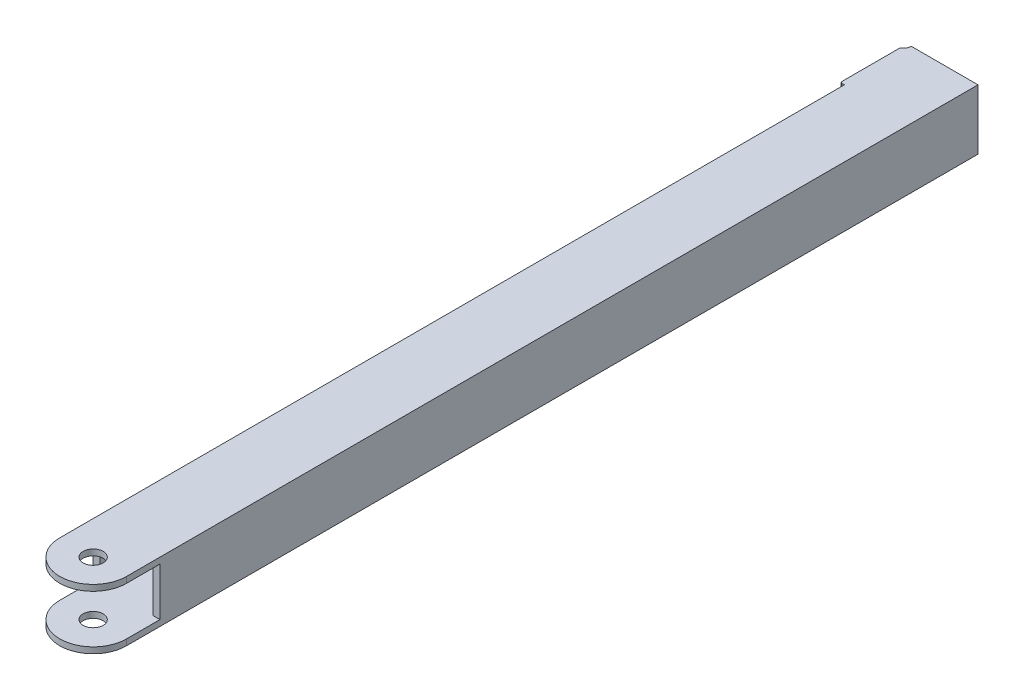
ISO-10303-21;
HEADER;
FILE_DESCRIPTION(('STEP AP214'),'2;1');
FILE_NAME('part.step','',(''),(''),'','','');
FILE_SCHEMA(('AUTOMOTIVE_DESIGN { 1 0 10303 214 1 1 1 1 }'));
ENDSEC;
DATA;
#1=APPLICATION_CONTEXT('core data for automotive mechanical design processes');
#2=APPLICATION_PROTOCOL_DEFINITION('international standard','automotive_design',2000,#1);
#3=PRODUCT_CONTEXT('',#1,'mechanical');
#4=PRODUCT('Part','Part','',(#3));
#5=PRODUCT_RELATED_PRODUCT_CATEGORY('part','',(#4));
#6=PRODUCT_DEFINITION_FORMATION('','',#4);
#7=PRODUCT_DEFINITION_CONTEXT('part definition',#1,'design');
#8=PRODUCT_DEFINITION('design','',#6,#7);
#9=PRODUCT_DEFINITION_SHAPE('','',#8);
#10=(LENGTH_UNIT() NAMED_UNIT(*) SI_UNIT(.MILLI.,.METRE.));
#11=(NAMED_UNIT(*) PLANE_ANGLE_UNIT() SI_UNIT($,.RADIAN.));
#12=(NAMED_UNIT(*) SI_UNIT($,.STERADIAN.) SOLID_ANGLE_UNIT());
#13=UNCERTAINTY_MEASURE_WITH_UNIT(LENGTH_MEASURE(1.E-05),#10,'distance_accuracy_value','');
#14=(GEOMETRIC_REPRESENTATION_CONTEXT(3) GLOBAL_UNCERTAINTY_ASSIGNED_CONTEXT((#13)) GLOBAL_UNIT_ASSIGNED_CONTEXT((#10,
#11,#12)) REPRESENTATION_CONTEXT('',''));
#15=CARTESIAN_POINT('',(0.,0.,0.));
#16=DIRECTION('',(0.,0.,1.));
#17=DIRECTION('',(1.,0.,0.));
#18=AXIS2_PLACEMENT_3D('',#15,#16,#17);
#19=CARTESIAN_POINT('',(-25.,18.,0.));
#20=DIRECTION('',(0.,-1.,0.));
#21=DIRECTION('',(0.,0.,-1.));
#22=AXIS2_PLACEMENT_3D('',#19,#20,#21);
#23=CYLINDRICAL_SURFACE('',#22,5.);
#24=DIRECTION('',(0.,-1.,0.));
#25=VECTOR('',#24,1.);
#26=CARTESIAN_POINT('',(-22.5,18.,4.33012701892219));
#27=LINE('',#26,#25);
#28=CARTESIAN_POINT('',(-22.5,-9.,4.33012701892219));
#29=VERTEX_POINT('',#28);
#30=CARTESIAN_POINT('',(-22.5,-18.,4.33012701892219));
#31=VERTEX_POINT('',#30);
#32=EDGE_CURVE('E207',#29,#31,#27,.T.);
#33=ORIENTED_EDGE('',*,*,#32,.F.);
#34=CARTESIAN_POINT('',(-25.,-9.,0.));
#35=DIRECTION('',(0.,1.,0.));
#36=DIRECTION('',(0.,0.,1.));
#37=AXIS2_PLACEMENT_3D('',#34,#35,#36);
#38=CIRCLE('',#37,5.);
#39=CARTESIAN_POINT('',(-20.,-9.,0.));
#40=VERTEX_POINT('',#39);
#41=EDGE_CURVE('E214',#40,#29,#38,.T.);
#42=ORIENTED_EDGE('',*,*,#41,.F.);
#43=DIRECTION('',(0.,-1.,0.));
#44=VECTOR('',#43,1.);
#45=CARTESIAN_POINT('',(-20.,18.,0.));
#46=LINE('',#45,#44);
#47=CARTESIAN_POINT('',(-20.,-18.,0.));
#48=VERTEX_POINT('',#47);
#49=EDGE_CURVE('E319',#40,#48,#46,.T.);
#50=ORIENTED_EDGE('',*,*,#49,.T.);
#51=CARTESIAN_POINT('',(-25.,-18.,0.));
#52=DIRECTION('',(0.,-1.,0.));
#53=DIRECTION('',(0.,0.,-1.));
#54=AXIS2_PLACEMENT_3D('',#51,#52,#53);
#55=CIRCLE('',#54,5.);
#56=EDGE_CURVE('E386',#31,#48,#55,.T.);
#57=ORIENTED_EDGE('',*,*,#56,.F.);
#58=EDGE_LOOP('',(#33,#42,#50,#57));
#59=FACE_BOUND('',#58,.T.);
#60=ADVANCED_FACE('F43',(#59),#23,.T.);
#61=CARTESIAN_POINT('',(-25.,18.,0.));
#62=DIRECTION('',(0.,-1.,0.));
#63=DIRECTION('',(0.,0.,-1.));
#64=AXIS2_PLACEMENT_3D('',#61,#62,#63);
#65=CYLINDRICAL_SURFACE('',#64,2.5);
#66=CARTESIAN_POINT('',(-25.,-18.,0.));
#67=DIRECTION('',(0.,-1.,0.));
#68=DIRECTION('',(0.,0.,-1.));
#69=AXIS2_PLACEMENT_3D('',#66,#67,#68);
#70=CIRCLE('',#69,2.5);
#71=CARTESIAN_POINT('',(-25.,-18.,-2.5));
#72=VERTEX_POINT('',#71);
#73=EDGE_CURVE('E370',#72,#72,#70,.T.);
#74=ORIENTED_EDGE('',*,*,#73,.T.);
#75=EDGE_LOOP('',(#74));
#76=FACE_BOUND('',#75,.T.);
#77=CARTESIAN_POINT('',(-25.,-9.,0.));
#78=DIRECTION('',(0.,1.,0.));
#79=DIRECTION('',(0.,0.,1.));
#80=AXIS2_PLACEMENT_3D('',#77,#78,#79);
#81=CIRCLE('',#80,2.5);
#82=CARTESIAN_POINT('',(-25.,-9.,2.5));
#83=VERTEX_POINT('',#82);
#84=EDGE_CURVE('E401',#83,#83,#81,.F.);
#85=ORIENTED_EDGE('',*,*,#84,.F.);
#86=EDGE_LOOP('',(#85));
#87=FACE_BOUND('',#86,.T.);
#88=ADVANCED_FACE('F487',(#76,#87),#65,.F.);
#89=CARTESIAN_POINT('',(-25.,0.,0.));
#90=DIRECTION('',(0.,1.,0.));
#91=DIRECTION('',(0.,0.,1.));
#92=AXIS2_PLACEMENT_3D('',#89,#90,#91);
#93=CIRCLE('',#92,5.);
#94=CARTESIAN_POINT('',(-20.,0.,0.));
#95=VERTEX_POINT('',#94);
#96=CARTESIAN_POINT('',(-22.5,0.,4.33012701892219));
#97=VERTEX_POINT('',#96);
#98=EDGE_CURVE('E213',#95,#97,#93,.T.);
#99=ORIENTED_EDGE('',*,*,#98,.T.);
#100=CARTESIAN_POINT('',(-22.5,9.,4.33012701892219));
#101=VERTEX_POINT('',#100);
#102=EDGE_CURVE('E206',#101,#97,#27,.T.);
#103=ORIENTED_EDGE('',*,*,#102,.F.);
#104=CARTESIAN_POINT('',(-25.,9.,0.));
#105=DIRECTION('',(0.,1.,0.));
#106=DIRECTION('',(0.,0.,1.));
#107=AXIS2_PLACEMENT_3D('',#104,#105,#106);
#108=CIRCLE('',#107,5.);
#109=CARTESIAN_POINT('',(-20.,9.,0.));
#110=VERTEX_POINT('',#109);
#111=EDGE_CURVE('E396',#110,#101,#108,.T.);
#112=ORIENTED_EDGE('',*,*,#111,.F.);
#113=EDGE_CURVE('E223',#110,#95,#46,.T.);
#114=ORIENTED_EDGE('',*,*,#113,.T.);
#115=EDGE_LOOP('',(#99,#103,#112,#114));
#116=FACE_BOUND('',#115,.T.);
#117=ADVANCED_FACE('F219',(#116),#23,.T.);
#118=CARTESIAN_POINT('',(-25.,0.,0.));
#119=DIRECTION('',(0.,1.,0.));
#120=DIRECTION('',(0.,0.,1.));
#121=AXIS2_PLACEMENT_3D('',#118,#119,#120);
#122=CIRCLE('',#121,2.5);
#123=CARTESIAN_POINT('',(-25.,0.,2.5));
#124=VERTEX_POINT('',#123);
#125=EDGE_CURVE('E404',#124,#124,#122,.F.);
#126=ORIENTED_EDGE('',*,*,#125,.T.);
#127=EDGE_LOOP('',(#126));
#128=FACE_BOUND('',#127,.T.);
#129=CARTESIAN_POINT('',(-25.,9.,0.));
#130=DIRECTION('',(0.,1.,0.));
#131=DIRECTION('',(0.,0.,1.));
#132=AXIS2_PLACEMENT_3D('',#129,#130,#131);
#133=CIRCLE('',#132,2.5);
#134=CARTESIAN_POINT('',(-25.,9.,2.5));
#135=VERTEX_POINT('',#134);
#136=EDGE_CURVE('E367',#135,#135,#133,.F.);
#137=ORIENTED_EDGE('',*,*,#136,.F.);
#138=EDGE_LOOP('',(#137));
#139=FACE_BOUND('',#138,.T.);
#140=ADVANCED_FACE('F494',(#128,#139),#65,.F.);
#141=CARTESIAN_POINT('',(0.,14.4,510.));
#142=DIRECTION('',(0.,-1.,0.));
#143=DIRECTION('',(1.,0.,0.));
#144=AXIS2_PLACEMENT_3D('',#141,#142,#143);
#145=CYLINDRICAL_SURFACE('',#144,20.);
#146=DIRECTION('',(0.,1.,0.));
#147=VECTOR('',#146,1.);
#148=CARTESIAN_POINT('',(-20.,14.4,510.));
#149=LINE('',#148,#147);
#150=CARTESIAN_POINT('',(-20.,14.4,510.));
#151=VERTEX_POINT('',#150);
#152=CARTESIAN_POINT('',(-20.,18.,510.));
#153=VERTEX_POINT('',#152);
#154=EDGE_CURVE('E345',#151,#153,#149,.T.);
#155=ORIENTED_EDGE('',*,*,#154,.F.);
#156=CARTESIAN_POINT('',(0.,14.4,510.));
#157=DIRECTION('',(0.,-1.,0.));
#158=DIRECTION('',(0.,0.,-1.));
#159=AXIS2_PLACEMENT_3D('',#156,#157,#158);
#160=CIRCLE('',#159,20.);
#161=CARTESIAN_POINT('',(20.,14.4,510.));
#162=VERTEX_POINT('',#161);
#163=EDGE_CURVE('E351',#162,#151,#160,.T.);
#164=ORIENTED_EDGE('',*,*,#163,.F.);
#165=DIRECTION('',(0.,1.,0.));
#166=VECTOR('',#165,1.);
#167=CARTESIAN_POINT('',(20.,14.4,510.));
#168=LINE('',#167,#166);
#169=CARTESIAN_POINT('',(20.,18.,510.));
#170=VERTEX_POINT('',#169);
#171=EDGE_CURVE('E348',#170,#162,#168,.F.);
#172=ORIENTED_EDGE('',*,*,#171,.F.);
#173=CARTESIAN_POINT('',(0.,18.,510.));
#174=DIRECTION('',(0.,-1.,0.));
#175=DIRECTION('',(0.,0.,-1.));
#176=AXIS2_PLACEMENT_3D('',#173,#174,#175);
#177=CIRCLE('',#176,20.);
#178=EDGE_CURVE('E353',#153,#170,#177,.F.);
#179=ORIENTED_EDGE('',*,*,#178,.F.);
#180=EDGE_LOOP('',(#155,#164,#172,#179));
#181=FACE_BOUND('',#180,.T.);
#182=ADVANCED_FACE('F446',(#181),#145,.T.);
#183=CARTESIAN_POINT('',(0.,-18.,510.));
#184=DIRECTION('',(0.,-1.,0.));
#185=DIRECTION('',(1.,0.,0.));
#186=AXIS2_PLACEMENT_3D('',#183,#184,#185);
#187=CYLINDRICAL_SURFACE('',#186,20.);
#188=DIRECTION('',(0.,1.,0.));
#189=VECTOR('',#188,1.);
#190=CARTESIAN_POINT('',(-20.,-18.,510.));
#191=LINE('',#190,#189);
#192=CARTESIAN_POINT('',(-20.,-18.,510.));
#193=VERTEX_POINT('',#192);
#194=CARTESIAN_POINT('',(-20.,-14.4,510.));
#195=VERTEX_POINT('',#194);
#196=EDGE_CURVE('E335',#193,#195,#191,.T.);
#197=ORIENTED_EDGE('',*,*,#196,.F.);
#198=CARTESIAN_POINT('',(0.,-18.,510.));
#199=DIRECTION('',(0.,1.,0.));
#200=DIRECTION('',(0.,0.,1.));
#201=AXIS2_PLACEMENT_3D('',#198,#199,#200);
#202=CIRCLE('',#201,20.);
#203=CARTESIAN_POINT('',(20.,-18.,510.));
#204=VERTEX_POINT('',#203);
#205=EDGE_CURVE('E341',#204,#193,#202,.F.);
#206=ORIENTED_EDGE('',*,*,#205,.F.);
#207=DIRECTION('',(0.,1.,0.));
#208=VECTOR('',#207,1.);
#209=CARTESIAN_POINT('',(20.,-18.,510.));
#210=LINE('',#209,#208);
#211=CARTESIAN_POINT('',(20.,-14.4,510.));
#212=VERTEX_POINT('',#211);
#213=EDGE_CURVE('E338',#212,#204,#210,.F.);
#214=ORIENTED_EDGE('',*,*,#213,.F.);
#215=CARTESIAN_POINT('',(0.,-14.4,510.));
#216=DIRECTION('',(0.,1.,0.));
#217=DIRECTION('',(-1.,0.,0.));
#218=AXIS2_PLACEMENT_3D('',#215,#216,#217);
#219=CIRCLE('',#218,20.);
#220=EDGE_CURVE('E343',#195,#212,#219,.T.);
#221=ORIENTED_EDGE('',*,*,#220,.F.);
#222=EDGE_LOOP('',(#197,#206,#214,#221));
#223=FACE_BOUND('',#222,.T.);
#224=ADVANCED_FACE('F439',(#223),#187,.T.);
#225=CARTESIAN_POINT('',(0.,0.,0.));
#226=DIRECTION('',(0.,0.,1.));
#227=DIRECTION('',(1.,0.,0.));
#228=AXIS2_PLACEMENT_3D('',#225,#226,#227);
#229=PLANE('',#228);
#230=DIRECTION('',(0.,1.,0.));
#231=VECTOR('',#230,1.);
#232=CARTESIAN_POINT('',(20.,18.,0.));
#233=LINE('',#232,#231);
#234=CARTESIAN_POINT('',(20.,-18.,0.));
#235=VERTEX_POINT('',#234);
#236=CARTESIAN_POINT('',(20.,18.,0.));
#237=VERTEX_POINT('',#236);
#238=EDGE_CURVE('E313',#235,#237,#233,.T.);
#239=ORIENTED_EDGE('',*,*,#238,.F.);
#240=DIRECTION('',(1.,0.,0.));
#241=VECTOR('',#240,1.);
#242=CARTESIAN_POINT('',(-20.,-18.,0.));
#243=LINE('',#242,#241);
#244=EDGE_CURVE('E322',#48,#235,#243,.T.);
#245=ORIENTED_EDGE('',*,*,#244,.F.);
#246=ORIENTED_EDGE('',*,*,#49,.F.);
#247=DIRECTION('',(0.,1.,0.));
#248=VECTOR('',#247,1.);
#249=CARTESIAN_POINT('',(-20.,-9.,0.));
#250=LINE('',#249,#248);
#251=EDGE_CURVE('E397',#40,#95,#250,.T.);
#252=ORIENTED_EDGE('',*,*,#251,.T.);
#253=ORIENTED_EDGE('',*,*,#113,.F.);
#254=CARTESIAN_POINT('',(-20.,18.,0.));
#255=VERTEX_POINT('',#254);
#256=EDGE_CURVE('E320',#255,#110,#46,.T.);
#257=ORIENTED_EDGE('',*,*,#256,.F.);
#258=DIRECTION('',(-1.,0.,0.));
#259=VECTOR('',#258,1.);
#260=CARTESIAN_POINT('',(-20.,18.,0.));
#261=LINE('',#260,#259);
#262=EDGE_CURVE('E316',#237,#255,#261,.T.);
#263=ORIENTED_EDGE('',*,*,#262,.F.);
#264=EDGE_LOOP('',(#239,#245,#246,#252,#253,#257,#263));
#265=FACE_BOUND('',#264,.T.);
#266=DIRECTION('',(0.,1.,0.));
#267=VECTOR('',#266,1.);
#268=CARTESIAN_POINT('',(16.,14.4,0.));
#269=LINE('',#268,#267);
#270=CARTESIAN_POINT('',(16.,-14.4,0.));
#271=VERTEX_POINT('',#270);
#272=CARTESIAN_POINT('',(16.,14.4,0.));
#273=VERTEX_POINT('',#272);
#274=EDGE_CURVE('E293',#271,#273,#269,.T.);
#275=ORIENTED_EDGE('',*,*,#274,.T.);
#276=DIRECTION('',(-1.,0.,0.));
#277=VECTOR('',#276,1.);
#278=CARTESIAN_POINT('',(-16.,14.4,0.));
#279=LINE('',#278,#277);
#280=CARTESIAN_POINT('',(-16.,14.4,0.));
#281=VERTEX_POINT('',#280);
#282=EDGE_CURVE('E296',#273,#281,#279,.T.);
#283=ORIENTED_EDGE('',*,*,#282,.T.);
#284=DIRECTION('',(0.,-1.,0.));
#285=VECTOR('',#284,1.);
#286=CARTESIAN_POINT('',(-16.,14.4,0.));
#287=LINE('',#286,#285);
#288=CARTESIAN_POINT('',(-16.,-14.4,0.));
#289=VERTEX_POINT('',#288);
#290=EDGE_CURVE('E299',#281,#289,#287,.T.);
#291=ORIENTED_EDGE('',*,*,#290,.T.);
#292=DIRECTION('',(1.,0.,0.));
#293=VECTOR('',#292,1.);
#294=CARTESIAN_POINT('',(-16.,-14.4,0.));
#295=LINE('',#294,#293);
#296=EDGE_CURVE('E302',#289,#271,#295,.T.);
#297=ORIENTED_EDGE('',*,*,#296,.T.);
#298=EDGE_LOOP('',(#275,#283,#291,#297));
#299=FACE_BOUND('',#298,.T.);
#300=ADVANCED_FACE('F428',(#265,#299),#229,.F.);
#301=CARTESIAN_POINT('',(20.,18.,530.));
#302=DIRECTION('',(-1.,0.,0.));
#303=DIRECTION('',(0.,-1.,0.));
#304=AXIS2_PLACEMENT_3D('',#301,#302,#303);
#305=PLANE('',#304);
#306=DIRECTION('',(0.,0.,-1.));
#307=VECTOR('',#306,1.);
#308=CARTESIAN_POINT('',(20.,18.,530.));
#309=LINE('',#308,#307);
#310=EDGE_CURVE('E333',#170,#237,#309,.T.);
#311=ORIENTED_EDGE('',*,*,#310,.F.);
#312=ORIENTED_EDGE('',*,*,#171,.T.);
#313=DIRECTION('',(0.,0.,-1.));
#314=VECTOR('',#313,1.);
#315=CARTESIAN_POINT('',(20.,14.4,530.));
#316=LINE('',#315,#314);
#317=CARTESIAN_POINT('',(20.,14.4,490.));
#318=VERTEX_POINT('',#317);
#319=EDGE_CURVE('E286',#162,#318,#316,.T.);
#320=ORIENTED_EDGE('',*,*,#319,.T.);
#321=DIRECTION('',(0.,-1.,0.));
#322=VECTOR('',#321,1.);
#323=CARTESIAN_POINT('',(20.,18.,490.));
#324=LINE('',#323,#322);
#325=CARTESIAN_POINT('',(20.,-14.4,490.));
#326=VERTEX_POINT('',#325);
#327=EDGE_CURVE('E280',#318,#326,#324,.T.);
#328=ORIENTED_EDGE('',*,*,#327,.T.);
#329=DIRECTION('',(0.,0.,1.));
#330=VECTOR('',#329,1.);
#331=CARTESIAN_POINT('',(20.,-14.4,530.));
#332=LINE('',#331,#330);
#333=EDGE_CURVE('E290',#326,#212,#332,.T.);
#334=ORIENTED_EDGE('',*,*,#333,.T.);
#335=ORIENTED_EDGE('',*,*,#213,.T.);
#336=DIRECTION('',(0.,0.,-1.));
#337=VECTOR('',#336,1.);
#338=CARTESIAN_POINT('',(20.,-18.,530.));
#339=LINE('',#338,#337);
#340=EDGE_CURVE('E325',#204,#235,#339,.T.);
#341=ORIENTED_EDGE('',*,*,#340,.T.);
#342=ORIENTED_EDGE('',*,*,#238,.T.);
#343=EDGE_LOOP('',(#311,#312,#320,#328,#334,#335,#341,#342));
#344=FACE_BOUND('',#343,.T.);
#345=ADVANCED_FACE('F435',(#344),#305,.F.);
#346=CARTESIAN_POINT('',(-20.,18.,530.));
#347=DIRECTION('',(0.,-1.,0.));
#348=DIRECTION('',(0.,0.,-1.));
#349=AXIS2_PLACEMENT_3D('',#346,#347,#348);
#350=PLANE('',#349);
#351=CARTESIAN_POINT('',(0.,18.,510.));
#352=DIRECTION('',(0.,-1.,0.));
#353=DIRECTION('',(0.,0.,-1.));
#354=AXIS2_PLACEMENT_3D('',#351,#352,#353);
#355=CIRCLE('',#354,6.);
#356=CARTESIAN_POINT('',(0.,18.,504.));
#357=VERTEX_POINT('',#356);
#358=EDGE_CURVE('E262',#357,#357,#355,.T.);
#359=ORIENTED_EDGE('',*,*,#358,.T.);
#360=EDGE_LOOP('',(#359));
#361=FACE_BOUND('',#360,.T.);
#362=DIRECTION('',(0.,0.,-1.));
#363=VECTOR('',#362,1.);
#364=CARTESIAN_POINT('',(-22.5,18.,40.));
#365=LINE('',#364,#363);
#366=CARTESIAN_POINT('',(-22.5,18.,39.));
#367=VERTEX_POINT('',#366);
#368=CARTESIAN_POINT('',(-22.5,18.,4.33012701892219));
#369=VERTEX_POINT('',#368);
#370=EDGE_CURVE('E235',#367,#369,#365,.T.);
#371=ORIENTED_EDGE('',*,*,#370,.F.);
#372=CARTESIAN_POINT('',(-21.5,18.,39.));
#373=DIRECTION('',(0.,-1.,0.));
#374=DIRECTION('',(0.,0.,-1.));
#375=AXIS2_PLACEMENT_3D('',#372,#373,#374);
#376=CIRCLE('',#375,1.);
#377=CARTESIAN_POINT('',(-21.5,18.,40.));
#378=VERTEX_POINT('',#377);
#379=EDGE_CURVE('E11',#367,#378,#376,.F.);
#380=ORIENTED_EDGE('',*,*,#379,.T.);
#381=DIRECTION('',(-1.,0.,0.));
#382=VECTOR('',#381,1.);
#383=CARTESIAN_POINT('',(-20.,18.,40.));
#384=LINE('',#383,#382);
#385=CARTESIAN_POINT('',(-20.,18.,40.));
#386=VERTEX_POINT('',#385);
#387=EDGE_CURVE('E380',#386,#378,#384,.T.);
#388=ORIENTED_EDGE('',*,*,#387,.F.);
#389=DIRECTION('',(0.,0.,-1.));
#390=VECTOR('',#389,1.);
#391=CARTESIAN_POINT('',(-20.,18.,530.));
#392=LINE('',#391,#390);
#393=EDGE_CURVE('E330',#153,#386,#392,.T.);
#394=ORIENTED_EDGE('',*,*,#393,.F.);
#395=ORIENTED_EDGE('',*,*,#178,.T.);
#396=ORIENTED_EDGE('',*,*,#310,.T.);
#397=ORIENTED_EDGE('',*,*,#262,.T.);
#398=CARTESIAN_POINT('',(-25.,18.,0.));
#399=DIRECTION('',(0.,1.,0.));
#400=DIRECTION('',(0.,0.,1.));
#401=AXIS2_PLACEMENT_3D('',#398,#399,#400);
#402=CIRCLE('',#401,5.);
#403=EDGE_CURVE('E394',#369,#255,#402,.T.);
#404=ORIENTED_EDGE('',*,*,#403,.F.);
#405=EDGE_LOOP('',(#371,#380,#388,#394,#395,#396,#397,#404));
#406=FACE_BOUND('',#405,.T.);
#407=ADVANCED_FACE('F416',(#361,#406),#350,.F.);
#408=CARTESIAN_POINT('',(-20.,18.,530.));
#409=DIRECTION('',(1.,0.,0.));
#410=DIRECTION('',(0.,1.,0.));
#411=AXIS2_PLACEMENT_3D('',#408,#409,#410);
#412=PLANE('',#411);
#413=ORIENTED_EDGE('',*,*,#393,.T.);
#414=DIRECTION('',(0.,-1.,0.));
#415=VECTOR('',#414,1.);
#416=CARTESIAN_POINT('',(-20.,18.,40.));
#417=LINE('',#416,#415);
#418=CARTESIAN_POINT('',(-20.,-18.,40.));
#419=VERTEX_POINT('',#418);
#420=EDGE_CURVE('E232',#386,#419,#417,.T.);
#421=ORIENTED_EDGE('',*,*,#420,.T.);
#422=DIRECTION('',(0.,0.,-1.));
#423=VECTOR('',#422,1.);
#424=CARTESIAN_POINT('',(-20.,-18.,530.));
#425=LINE('',#424,#423);
#426=EDGE_CURVE('E327',#193,#419,#425,.T.);
#427=ORIENTED_EDGE('',*,*,#426,.F.);
#428=ORIENTED_EDGE('',*,*,#196,.T.);
#429=DIRECTION('',(0.,0.,-1.));
#430=VECTOR('',#429,1.);
#431=CARTESIAN_POINT('',(-20.,-14.4,530.));
#432=LINE('',#431,#430);
#433=CARTESIAN_POINT('',(-20.,-14.4,490.));
#434=VERTEX_POINT('',#433);
#435=EDGE_CURVE('E288',#195,#434,#432,.T.);
#436=ORIENTED_EDGE('',*,*,#435,.T.);
#437=DIRECTION('',(0.,1.,0.));
#438=VECTOR('',#437,1.);
#439=CARTESIAN_POINT('',(-20.,18.,490.));
#440=LINE('',#439,#438);
#441=CARTESIAN_POINT('',(-20.,14.4,490.));
#442=VERTEX_POINT('',#441);
#443=EDGE_CURVE('E277',#434,#442,#440,.T.);
#444=ORIENTED_EDGE('',*,*,#443,.T.);
#445=DIRECTION('',(0.,0.,1.));
#446=VECTOR('',#445,1.);
#447=CARTESIAN_POINT('',(-20.,14.4,530.));
#448=LINE('',#447,#446);
#449=EDGE_CURVE('E283',#442,#151,#448,.T.);
#450=ORIENTED_EDGE('',*,*,#449,.T.);
#451=ORIENTED_EDGE('',*,*,#154,.T.);
#452=EDGE_LOOP('',(#413,#421,#427,#428,#436,#444,#450,#451));
#453=FACE_BOUND('',#452,.T.);
#454=ADVANCED_FACE('F442',(#453),#412,.F.);
#455=CARTESIAN_POINT('',(-20.,-18.,530.));
#456=DIRECTION('',(0.,1.,0.));
#457=DIRECTION('',(0.,0.,1.));
#458=AXIS2_PLACEMENT_3D('',#455,#456,#457);
#459=PLANE('',#458);
#460=CARTESIAN_POINT('',(0.,-18.,360.));
#461=DIRECTION('',(0.,-1.,0.));
#462=DIRECTION('',(0.,0.,-1.));
#463=AXIS2_PLACEMENT_3D('',#460,#461,#462);
#464=CIRCLE('',#463,6.);
#465=CARTESIAN_POINT('',(-5.99999999999999,-18.,360.));
#466=VERTEX_POINT('',#465);
#467=CARTESIAN_POINT('',(6.,-18.,360.));
#468=VERTEX_POINT('',#467);
#469=EDGE_CURVE('E237',#466,#468,#464,.T.);
#470=ORIENTED_EDGE('',*,*,#469,.F.);
#471=DIRECTION('',(0.,0.,-1.));
#472=VECTOR('',#471,1.);
#473=CARTESIAN_POINT('',(-5.99999999999993,-18.,0.));
#474=LINE('',#473,#472);
#475=CARTESIAN_POINT('',(-6.,-18.,460.));
#476=VERTEX_POINT('',#475);
#477=EDGE_CURVE('E227',#476,#466,#474,.T.);
#478=ORIENTED_EDGE('',*,*,#477,.F.);
#479=CARTESIAN_POINT('',(0.,-18.,460.));
#480=DIRECTION('',(0.,-1.,0.));
#481=DIRECTION('',(0.,0.,-1.));
#482=AXIS2_PLACEMENT_3D('',#479,#480,#481);
#483=CIRCLE('',#482,6.00000000000001);
#484=CARTESIAN_POINT('',(6.00000000000001,-18.,460.));
#485=VERTEX_POINT('',#484);
#486=EDGE_CURVE('E243',#485,#476,#483,.T.);
#487=ORIENTED_EDGE('',*,*,#486,.F.);
#488=DIRECTION('',(0.,0.,-1.));
#489=VECTOR('',#488,1.);
#490=CARTESIAN_POINT('',(5.99999999999993,-18.,0.));
#491=LINE('',#490,#489);
#492=EDGE_CURVE('E240',#485,#468,#491,.T.);
#493=ORIENTED_EDGE('',*,*,#492,.T.);
#494=EDGE_LOOP('',(#470,#478,#487,#493));
#495=FACE_BOUND('',#494,.T.);
#496=CARTESIAN_POINT('',(0.,-18.,510.));
#497=DIRECTION('',(0.,1.,0.));
#498=DIRECTION('',(0.,0.,1.));
#499=AXIS2_PLACEMENT_3D('',#496,#497,#498);
#500=CIRCLE('',#499,6.);
#501=CARTESIAN_POINT('',(0.,-18.,516.));
#502=VERTEX_POINT('',#501);
#503=EDGE_CURVE('E249',#502,#502,#500,.T.);
#504=ORIENTED_EDGE('',*,*,#503,.T.);
#505=EDGE_LOOP('',(#504));
#506=FACE_BOUND('',#505,.T.);
#507=DIRECTION('',(-1.,0.,0.));
#508=VECTOR('',#507,1.);
#509=CARTESIAN_POINT('',(-20.,-18.,40.));
#510=LINE('',#509,#508);
#511=CARTESIAN_POINT('',(-21.5,-18.,40.));
#512=VERTEX_POINT('',#511);
#513=EDGE_CURVE('E378',#419,#512,#510,.T.);
#514=ORIENTED_EDGE('',*,*,#513,.T.);
#515=CARTESIAN_POINT('',(-21.5,-18.,39.));
#516=DIRECTION('',(0.,1.,0.));
#517=DIRECTION('',(0.,0.,1.));
#518=AXIS2_PLACEMENT_3D('',#515,#516,#517);
#519=CIRCLE('',#518,1.);
#520=CARTESIAN_POINT('',(-22.5,-18.,39.));
#521=VERTEX_POINT('',#520);
#522=EDGE_CURVE('E65',#512,#521,#519,.F.);
#523=ORIENTED_EDGE('',*,*,#522,.T.);
#524=DIRECTION('',(0.,0.,-1.));
#525=VECTOR('',#524,1.);
#526=CARTESIAN_POINT('',(-22.5,-18.,40.));
#527=LINE('',#526,#525);
#528=EDGE_CURVE('E230',#521,#31,#527,.T.);
#529=ORIENTED_EDGE('',*,*,#528,.T.);
#530=ORIENTED_EDGE('',*,*,#56,.T.);
#531=ORIENTED_EDGE('',*,*,#244,.T.);
#532=ORIENTED_EDGE('',*,*,#340,.F.);
#533=ORIENTED_EDGE('',*,*,#205,.T.);
#534=ORIENTED_EDGE('',*,*,#426,.T.);
#535=EDGE_LOOP('',(#514,#523,#529,#530,#531,#532,#533,#534));
#536=FACE_BOUND('',#535,.T.);
#537=ORIENTED_EDGE('',*,*,#73,.F.);
#538=EDGE_LOOP('',(#537));
#539=FACE_BOUND('',#538,.T.);
#540=ADVANCED_FACE('F383',(#495,#506,#536,#539),#459,.F.);
#541=CARTESIAN_POINT('',(16.,14.4,530.));
#542=DIRECTION('',(-1.,0.,0.));
#543=DIRECTION('',(0.,-1.,0.));
#544=AXIS2_PLACEMENT_3D('',#541,#542,#543);
#545=PLANE('',#544);
#546=DIRECTION('',(0.,-1.,0.));
#547=VECTOR('',#546,1.);
#548=CARTESIAN_POINT('',(16.,14.4,490.));
#549=LINE('',#548,#547);
#550=CARTESIAN_POINT('',(16.,14.4,490.));
#551=VERTEX_POINT('',#550);
#552=CARTESIAN_POINT('',(16.,-14.4,490.));
#553=VERTEX_POINT('',#552);
#554=EDGE_CURVE('E275',#551,#553,#549,.T.);
#555=ORIENTED_EDGE('',*,*,#554,.F.);
#556=DIRECTION('',(0.,0.,-1.));
#557=VECTOR('',#556,1.);
#558=CARTESIAN_POINT('',(16.,14.4,530.));
#559=LINE('',#558,#557);
#560=EDGE_CURVE('E311',#551,#273,#559,.T.);
#561=ORIENTED_EDGE('',*,*,#560,.T.);
#562=ORIENTED_EDGE('',*,*,#274,.F.);
#563=DIRECTION('',(0.,0.,-1.));
#564=VECTOR('',#563,1.);
#565=CARTESIAN_POINT('',(16.,-14.4,530.));
#566=LINE('',#565,#564);
#567=EDGE_CURVE('E305',#553,#271,#566,.T.);
#568=ORIENTED_EDGE('',*,*,#567,.F.);
#569=EDGE_LOOP('',(#555,#561,#562,#568));
#570=FACE_BOUND('',#569,.T.);
#571=ADVANCED_FACE('F460',(#570),#545,.T.);
#572=CARTESIAN_POINT('',(-16.,14.4,530.));
#573=DIRECTION('',(0.,-1.,0.));
#574=DIRECTION('',(0.,0.,-1.));
#575=AXIS2_PLACEMENT_3D('',#572,#573,#574);
#576=PLANE('',#575);
#577=CARTESIAN_POINT('',(0.,14.4,510.));
#578=DIRECTION('',(0.,-1.,0.));
#579=DIRECTION('',(0.,0.,-1.));
#580=AXIS2_PLACEMENT_3D('',#577,#578,#579);
#581=CIRCLE('',#580,6.);
#582=CARTESIAN_POINT('',(0.,14.4,504.));
#583=VERTEX_POINT('',#582);
#584=EDGE_CURVE('E259',#583,#583,#581,.T.);
#585=ORIENTED_EDGE('',*,*,#584,.F.);
#586=EDGE_LOOP('',(#585));
#587=FACE_BOUND('',#586,.T.);
#588=ORIENTED_EDGE('',*,*,#319,.F.);
#589=ORIENTED_EDGE('',*,*,#163,.T.);
#590=ORIENTED_EDGE('',*,*,#449,.F.);
#591=DIRECTION('',(-1.,0.,0.));
#592=VECTOR('',#591,1.);
#593=CARTESIAN_POINT('',(-25.,14.4,490.));
#594=LINE('',#593,#592);
#595=CARTESIAN_POINT('',(-16.,14.4,490.));
#596=VERTEX_POINT('',#595);
#597=EDGE_CURVE('E265',#596,#442,#594,.T.);
#598=ORIENTED_EDGE('',*,*,#597,.F.);
#599=DIRECTION('',(0.,0.,-1.));
#600=VECTOR('',#599,1.);
#601=CARTESIAN_POINT('',(-16.,14.4,530.));
#602=LINE('',#601,#600);
#603=EDGE_CURVE('E309',#596,#281,#602,.T.);
#604=ORIENTED_EDGE('',*,*,#603,.T.);
#605=ORIENTED_EDGE('',*,*,#282,.F.);
#606=ORIENTED_EDGE('',*,*,#560,.F.);
#607=EDGE_CURVE('E268',#318,#551,#594,.T.);
#608=ORIENTED_EDGE('',*,*,#607,.F.);
#609=EDGE_LOOP('',(#588,#589,#590,#598,#604,#605,#606,#608));
#610=FACE_BOUND('',#609,.T.);
#611=ADVANCED_FACE('F451',(#587,#610),#576,.T.);
#612=CARTESIAN_POINT('',(-16.,14.4,530.));
#613=DIRECTION('',(1.,0.,0.));
#614=DIRECTION('',(0.,1.,0.));
#615=AXIS2_PLACEMENT_3D('',#612,#613,#614);
#616=PLANE('',#615);
#617=DIRECTION('',(0.,1.,0.));
#618=VECTOR('',#617,1.);
#619=CARTESIAN_POINT('',(-16.,14.4,490.));
#620=LINE('',#619,#618);
#621=CARTESIAN_POINT('',(-16.,-14.4,490.));
#622=VERTEX_POINT('',#621);
#623=EDGE_CURVE('E273',#622,#596,#620,.T.);
#624=ORIENTED_EDGE('',*,*,#623,.F.);
#625=DIRECTION('',(0.,0.,-1.));
#626=VECTOR('',#625,1.);
#627=CARTESIAN_POINT('',(-16.,-14.4,530.));
#628=LINE('',#627,#626);
#629=EDGE_CURVE('E307',#622,#289,#628,.T.);
#630=ORIENTED_EDGE('',*,*,#629,.T.);
#631=ORIENTED_EDGE('',*,*,#290,.F.);
#632=ORIENTED_EDGE('',*,*,#603,.F.);
#633=EDGE_LOOP('',(#624,#630,#631,#632));
#634=FACE_BOUND('',#633,.T.);
#635=ADVANCED_FACE('F475',(#634),#616,.T.);
#636=CARTESIAN_POINT('',(-16.,-14.4,530.));
#637=DIRECTION('',(0.,1.,0.));
#638=DIRECTION('',(-1.,0.,0.));
#639=AXIS2_PLACEMENT_3D('',#636,#637,#638);
#640=PLANE('',#639);
#641=DIRECTION('',(0.,0.,1.));
#642=VECTOR('',#641,1.);
#643=CARTESIAN_POINT('',(-6.,-14.4,530.));
#644=LINE('',#643,#642);
#645=CARTESIAN_POINT('',(-5.99999999999999,-14.4,360.));
#646=VERTEX_POINT('',#645);
#647=CARTESIAN_POINT('',(-6.,-14.4,460.));
#648=VERTEX_POINT('',#647);
#649=EDGE_CURVE('E364',#646,#648,#644,.T.);
#650=ORIENTED_EDGE('',*,*,#649,.F.);
#651=CARTESIAN_POINT('',(0.,-14.4,360.));
#652=DIRECTION('',(0.,1.,0.));
#653=DIRECTION('',(-1.,0.,0.));
#654=AXIS2_PLACEMENT_3D('',#651,#652,#653);
#655=CIRCLE('',#654,6.);
#656=CARTESIAN_POINT('',(6.00000000000002,-14.4,360.));
#657=VERTEX_POINT('',#656);
#658=EDGE_CURVE('E355',#657,#646,#655,.T.);
#659=ORIENTED_EDGE('',*,*,#658,.F.);
#660=DIRECTION('',(0.,0.,1.));
#661=VECTOR('',#660,1.);
#662=CARTESIAN_POINT('',(6.,-14.4,530.));
#663=LINE('',#662,#661);
#664=CARTESIAN_POINT('',(6.00000000000001,-14.4,460.));
#665=VERTEX_POINT('',#664);
#666=EDGE_CURVE('E359',#657,#665,#663,.T.);
#667=ORIENTED_EDGE('',*,*,#666,.T.);
#668=CARTESIAN_POINT('',(0.,-14.4,460.));
#669=DIRECTION('',(0.,1.,0.));
#670=DIRECTION('',(-1.,0.,0.));
#671=AXIS2_PLACEMENT_3D('',#668,#669,#670);
#672=CIRCLE('',#671,6.00000000000001);
#673=EDGE_CURVE('E362',#648,#665,#672,.T.);
#674=ORIENTED_EDGE('',*,*,#673,.F.);
#675=EDGE_LOOP('',(#650,#659,#667,#674));
#676=FACE_BOUND('',#675,.T.);
#677=CARTESIAN_POINT('',(0.,-14.4,510.));
#678=DIRECTION('',(0.,1.,0.));
#679=DIRECTION('',(-1.,0.,0.));
#680=AXIS2_PLACEMENT_3D('',#677,#678,#679);
#681=CIRCLE('',#680,6.);
#682=CARTESIAN_POINT('',(-6.,-14.4,510.));
#683=VERTEX_POINT('',#682);
#684=EDGE_CURVE('E258',#683,#683,#681,.T.);
#685=ORIENTED_EDGE('',*,*,#684,.F.);
#686=EDGE_LOOP('',(#685));
#687=FACE_BOUND('',#686,.T.);
#688=ORIENTED_EDGE('',*,*,#435,.F.);
#689=ORIENTED_EDGE('',*,*,#220,.T.);
#690=ORIENTED_EDGE('',*,*,#333,.F.);
#691=DIRECTION('',(1.,0.,0.));
#692=VECTOR('',#691,1.);
#693=CARTESIAN_POINT('',(-25.,-14.4,490.));
#694=LINE('',#693,#692);
#695=EDGE_CURVE('E269',#553,#326,#694,.T.);
#696=ORIENTED_EDGE('',*,*,#695,.F.);
#697=ORIENTED_EDGE('',*,*,#567,.T.);
#698=ORIENTED_EDGE('',*,*,#296,.F.);
#699=ORIENTED_EDGE('',*,*,#629,.F.);
#700=EDGE_CURVE('E272',#434,#622,#694,.T.);
#701=ORIENTED_EDGE('',*,*,#700,.F.);
#702=EDGE_LOOP('',(#688,#689,#690,#696,#697,#698,#699,#701));
#703=FACE_BOUND('',#702,.T.);
#704=ADVANCED_FACE('F464',(#676,#687,#703),#640,.T.);
#705=CARTESIAN_POINT('',(0.,0.,490.));
#706=DIRECTION('',(0.,0.,-1.));
#707=DIRECTION('',(-1.,0.,0.));
#708=AXIS2_PLACEMENT_3D('',#705,#706,#707);
#709=PLANE('',#708);
#710=ORIENTED_EDGE('',*,*,#700,.T.);
#711=ORIENTED_EDGE('',*,*,#623,.T.);
#712=ORIENTED_EDGE('',*,*,#597,.T.);
#713=ORIENTED_EDGE('',*,*,#443,.F.);
#714=EDGE_LOOP('',(#710,#711,#712,#713));
#715=FACE_BOUND('',#714,.T.);
#716=ADVANCED_FACE('F469',(#715),#709,.F.);
#717=ORIENTED_EDGE('',*,*,#607,.T.);
#718=ORIENTED_EDGE('',*,*,#554,.T.);
#719=ORIENTED_EDGE('',*,*,#695,.T.);
#720=ORIENTED_EDGE('',*,*,#327,.F.);
#721=EDGE_LOOP('',(#717,#718,#719,#720));
#722=FACE_BOUND('',#721,.T.);
#723=ADVANCED_FACE('F456',(#722),#709,.F.);
#724=CARTESIAN_POINT('',(0.,-18.,510.));
#725=DIRECTION('',(0.,1.,0.));
#726=DIRECTION('',(0.,0.,1.));
#727=AXIS2_PLACEMENT_3D('',#724,#725,#726);
#728=CYLINDRICAL_SURFACE('',#727,6.);
#729=ORIENTED_EDGE('',*,*,#684,.T.);
#730=EDGE_LOOP('',(#729));
#731=FACE_BOUND('',#730,.T.);
#732=ORIENTED_EDGE('',*,*,#503,.F.);
#733=EDGE_LOOP('',(#732));
#734=FACE_BOUND('',#733,.T.);
#735=ADVANCED_FACE('F650',(#731,#734),#728,.F.);
#736=ORIENTED_EDGE('',*,*,#584,.T.);
#737=EDGE_LOOP('',(#736));
#738=FACE_BOUND('',#737,.T.);
#739=ORIENTED_EDGE('',*,*,#358,.F.);
#740=EDGE_LOOP('',(#739));
#741=FACE_BOUND('',#740,.T.);
#742=ADVANCED_FACE('F655',(#738,#741),#728,.F.);
#743=CARTESIAN_POINT('',(-5.99999999999993,-8.,0.));
#744=DIRECTION('',(-1.,0.,0.));
#745=DIRECTION('',(0.,0.,1.));
#746=AXIS2_PLACEMENT_3D('',#743,#744,#745);
#747=PLANE('',#746);
#748=ORIENTED_EDGE('',*,*,#649,.T.);
#749=DIRECTION('',(0.,-1.,0.));
#750=VECTOR('',#749,1.);
#751=CARTESIAN_POINT('',(-6.,-8.,460.));
#752=LINE('',#751,#750);
#753=EDGE_CURVE('E247',#648,#476,#752,.T.);
#754=ORIENTED_EDGE('',*,*,#753,.T.);
#755=ORIENTED_EDGE('',*,*,#477,.T.);
#756=DIRECTION('',(0.,-1.,0.));
#757=VECTOR('',#756,1.);
#758=CARTESIAN_POINT('',(-5.99999999999999,-8.,360.));
#759=LINE('',#758,#757);
#760=EDGE_CURVE('E246',#646,#466,#759,.T.);
#761=ORIENTED_EDGE('',*,*,#760,.F.);
#762=EDGE_LOOP('',(#748,#754,#755,#761));
#763=FACE_BOUND('',#762,.T.);
#764=ADVANCED_FACE('F666',(#763),#747,.F.);
#765=CARTESIAN_POINT('',(0.,-8.,460.));
#766=DIRECTION('',(0.,-1.,0.));
#767=DIRECTION('',(0.,0.,-1.));
#768=AXIS2_PLACEMENT_3D('',#765,#766,#767);
#769=CYLINDRICAL_SURFACE('',#768,6.00000000000001);
#770=ORIENTED_EDGE('',*,*,#673,.T.);
#771=DIRECTION('',(0.,-1.,0.));
#772=VECTOR('',#771,1.);
#773=CARTESIAN_POINT('',(6.00000000000001,-8.,460.));
#774=LINE('',#773,#772);
#775=EDGE_CURVE('E250',#665,#485,#774,.T.);
#776=ORIENTED_EDGE('',*,*,#775,.T.);
#777=ORIENTED_EDGE('',*,*,#486,.T.);
#778=ORIENTED_EDGE('',*,*,#753,.F.);
#779=EDGE_LOOP('',(#770,#776,#777,#778));
#780=FACE_BOUND('',#779,.T.);
#781=ADVANCED_FACE('F685',(#780),#769,.F.);
#782=CARTESIAN_POINT('',(5.99999999999993,-8.,0.));
#783=DIRECTION('',(-1.,0.,0.));
#784=DIRECTION('',(0.,0.,1.));
#785=AXIS2_PLACEMENT_3D('',#782,#783,#784);
#786=PLANE('',#785);
#787=DIRECTION('',(0.,-1.,0.));
#788=VECTOR('',#787,1.);
#789=CARTESIAN_POINT('',(6.,-8.,360.));
#790=LINE('',#789,#788);
#791=EDGE_CURVE('E252',#657,#468,#790,.T.);
#792=ORIENTED_EDGE('',*,*,#791,.T.);
#793=ORIENTED_EDGE('',*,*,#492,.F.);
#794=ORIENTED_EDGE('',*,*,#775,.F.);
#795=ORIENTED_EDGE('',*,*,#666,.F.);
#796=EDGE_LOOP('',(#792,#793,#794,#795));
#797=FACE_BOUND('',#796,.T.);
#798=ADVANCED_FACE('F694',(#797),#786,.T.);
#799=CARTESIAN_POINT('',(0.,-8.,360.));
#800=DIRECTION('',(0.,-1.,0.));
#801=DIRECTION('',(0.,0.,-1.));
#802=AXIS2_PLACEMENT_3D('',#799,#800,#801);
#803=CYLINDRICAL_SURFACE('',#802,6.);
#804=ORIENTED_EDGE('',*,*,#658,.T.);
#805=ORIENTED_EDGE('',*,*,#760,.T.);
#806=ORIENTED_EDGE('',*,*,#469,.T.);
#807=ORIENTED_EDGE('',*,*,#791,.F.);
#808=EDGE_LOOP('',(#804,#805,#806,#807));
#809=FACE_BOUND('',#808,.T.);
#810=ADVANCED_FACE('F510',(#809),#803,.F.);
#811=CARTESIAN_POINT('',(-22.5,18.,40.));
#812=DIRECTION('',(-1.,0.,0.));
#813=DIRECTION('',(0.,0.,1.));
#814=AXIS2_PLACEMENT_3D('',#811,#812,#813);
#815=PLANE('',#814);
#816=ORIENTED_EDGE('',*,*,#528,.F.);
#817=DIRECTION('',(0.,-1.,0.));
#818=VECTOR('',#817,1.);
#819=CARTESIAN_POINT('',(-22.5,18.,39.));
#820=LINE('',#819,#818);
#821=EDGE_CURVE('E51',#521,#367,#820,.F.);
#822=ORIENTED_EDGE('',*,*,#821,.T.);
#823=ORIENTED_EDGE('',*,*,#370,.T.);
#824=EDGE_CURVE('E226',#369,#101,#27,.T.);
#825=ORIENTED_EDGE('',*,*,#824,.T.);
#826=ORIENTED_EDGE('',*,*,#102,.T.);
#827=EDGE_CURVE('E196',#97,#29,#27,.T.);
#828=ORIENTED_EDGE('',*,*,#827,.T.);
#829=ORIENTED_EDGE('',*,*,#32,.T.);
#830=EDGE_LOOP('',(#816,#822,#823,#825,#826,#828,#829));
#831=FACE_BOUND('',#830,.T.);
#832=ADVANCED_FACE('F224',(#831),#815,.T.);
#833=CARTESIAN_POINT('',(-20.,18.,40.));
#834=DIRECTION('',(0.,0.,1.));
#835=DIRECTION('',(1.,0.,0.));
#836=AXIS2_PLACEMENT_3D('',#833,#834,#835);
#837=PLANE('',#836);
#838=ORIENTED_EDGE('',*,*,#387,.T.);
#839=DIRECTION('',(0.,-1.,0.));
#840=VECTOR('',#839,1.);
#841=CARTESIAN_POINT('',(-21.5,18.,40.));
#842=LINE('',#841,#840);
#843=EDGE_CURVE('E366',#378,#512,#842,.T.);
#844=ORIENTED_EDGE('',*,*,#843,.T.);
#845=ORIENTED_EDGE('',*,*,#513,.F.);
#846=ORIENTED_EDGE('',*,*,#420,.F.);
#847=EDGE_LOOP('',(#838,#844,#845,#846));
#848=FACE_BOUND('',#847,.T.);
#849=ADVANCED_FACE('F377',(#848),#837,.T.);
#850=CARTESIAN_POINT('',(-25.,9.,0.));
#851=DIRECTION('',(0.,1.,0.));
#852=DIRECTION('',(0.,0.,1.));
#853=AXIS2_PLACEMENT_3D('',#850,#851,#852);
#854=CYLINDRICAL_SURFACE('',#853,5.);
#855=EDGE_CURVE('E371',#101,#110,#108,.T.);
#856=ORIENTED_EDGE('',*,*,#855,.F.);
#857=ORIENTED_EDGE('',*,*,#824,.F.);
#858=ORIENTED_EDGE('',*,*,#403,.T.);
#859=ORIENTED_EDGE('',*,*,#256,.T.);
#860=EDGE_LOOP('',(#856,#857,#858,#859));
#861=FACE_BOUND('',#860,.T.);
#862=ADVANCED_FACE('F420',(#861),#854,.F.);
#863=CARTESIAN_POINT('',(-25.,9.,0.));
#864=DIRECTION('',(0.,1.,0.));
#865=DIRECTION('',(0.,0.,1.));
#866=AXIS2_PLACEMENT_3D('',#863,#864,#865);
#867=PLANE('',#866);
#868=ORIENTED_EDGE('',*,*,#855,.T.);
#869=ORIENTED_EDGE('',*,*,#111,.T.);
#870=EDGE_LOOP('',(#868,#869));
#871=FACE_BOUND('',#870,.T.);
#872=ORIENTED_EDGE('',*,*,#136,.T.);
#873=EDGE_LOOP('',(#872));
#874=FACE_BOUND('',#873,.T.);
#875=ADVANCED_FACE('F424',(#871,#874),#867,.T.);
#876=CARTESIAN_POINT('',(-25.,-9.,0.));
#877=DIRECTION('',(0.,1.,0.));
#878=DIRECTION('',(0.,0.,1.));
#879=AXIS2_PLACEMENT_3D('',#876,#877,#878);
#880=CYLINDRICAL_SURFACE('',#879,5.);
#881=EDGE_CURVE('E202',#29,#40,#38,.T.);
#882=ORIENTED_EDGE('',*,*,#881,.F.);
#883=ORIENTED_EDGE('',*,*,#827,.F.);
#884=EDGE_CURVE('E199',#97,#95,#93,.T.);
#885=ORIENTED_EDGE('',*,*,#884,.T.);
#886=ORIENTED_EDGE('',*,*,#251,.F.);
#887=EDGE_LOOP('',(#882,#883,#885,#886));
#888=FACE_BOUND('',#887,.T.);
#889=ADVANCED_FACE('F198',(#888),#880,.F.);
#890=CARTESIAN_POINT('',(-25.,-9.,0.));
#891=DIRECTION('',(0.,1.,0.));
#892=DIRECTION('',(0.,0.,1.));
#893=AXIS2_PLACEMENT_3D('',#890,#891,#892);
#894=PLANE('',#893);
#895=ORIENTED_EDGE('',*,*,#881,.T.);
#896=ORIENTED_EDGE('',*,*,#41,.T.);
#897=EDGE_LOOP('',(#895,#896));
#898=FACE_BOUND('',#897,.T.);
#899=ORIENTED_EDGE('',*,*,#84,.T.);
#900=EDGE_LOOP('',(#899));
#901=FACE_BOUND('',#900,.T.);
#902=ADVANCED_FACE('F410',(#898,#901),#894,.T.);
#903=CARTESIAN_POINT('',(-25.,0.,0.));
#904=DIRECTION('',(0.,1.,0.));
#905=DIRECTION('',(0.,0.,1.));
#906=AXIS2_PLACEMENT_3D('',#903,#904,#905);
#907=PLANE('',#906);
#908=ORIENTED_EDGE('',*,*,#884,.F.);
#909=ORIENTED_EDGE('',*,*,#98,.F.);
#910=EDGE_LOOP('',(#908,#909));
#911=FACE_BOUND('',#910,.T.);
#912=ORIENTED_EDGE('',*,*,#125,.F.);
#913=EDGE_LOOP('',(#912));
#914=FACE_BOUND('',#913,.T.);
#915=ADVANCED_FACE('F211',(#911,#914),#907,.F.);
#916=CARTESIAN_POINT('',(-21.5,18.,39.));
#917=DIRECTION('',(0.,-1.,0.));
#918=DIRECTION('',(0.,0.,-1.));
#919=AXIS2_PLACEMENT_3D('',#916,#917,#918);
#920=CYLINDRICAL_SURFACE('',#919,1.);
#921=ORIENTED_EDGE('',*,*,#379,.F.);
#922=ORIENTED_EDGE('',*,*,#821,.F.);
#923=ORIENTED_EDGE('',*,*,#522,.F.);
#924=ORIENTED_EDGE('',*,*,#843,.F.);
#925=EDGE_LOOP('',(#921,#922,#923,#924));
#926=FACE_BOUND('',#925,.T.);
#927=ADVANCED_FACE('F45',(#926),#920,.T.);
#928=CLOSED_SHELL('',(#60,#88,#117,#140,#182,#224,#300,#345,#407,#454,#540,#571,#611,#635,#704,
#716,#723,#735,#742,#764,#781,#798,#810,#832,#849,#862,#875,#889,#902,#915,#927));
#929=MANIFOLD_SOLID_BREP('B2',#928);
#930=ADVANCED_BREP_SHAPE_REPRESENTATION('',(#18,#929),#14);
#931=SHAPE_DEFINITION_REPRESENTATION(#9,#930);
ENDSEC;
END-ISO-10303-21;
